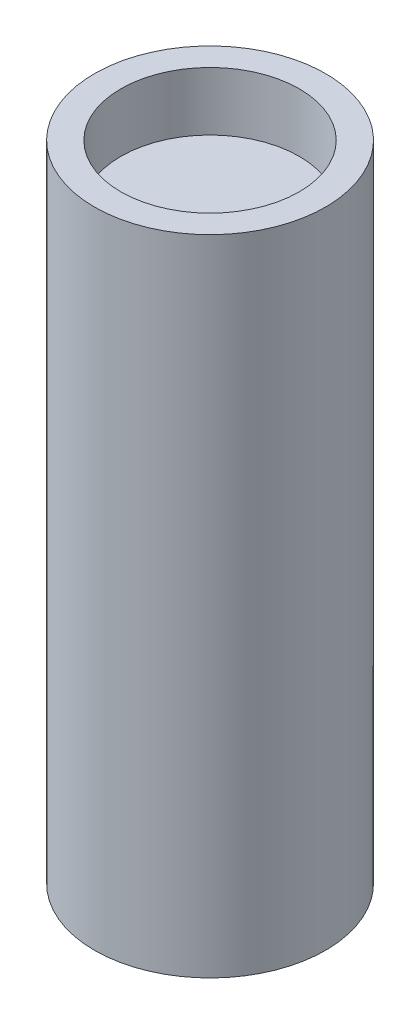
ISO-10303-21;
HEADER;
FILE_DESCRIPTION(('STEP AP214'),'2;1');
FILE_NAME('part.step','',(''),(''),'','','');
FILE_SCHEMA(('AUTOMOTIVE_DESIGN { 1 0 10303 214 1 1 1 1 }'));
ENDSEC;
DATA;
#1=APPLICATION_CONTEXT('core data for automotive mechanical design processes');
#2=APPLICATION_PROTOCOL_DEFINITION('international standard','automotive_design',2000,#1);
#3=PRODUCT_CONTEXT('',#1,'mechanical');
#4=PRODUCT('Part','Part','',(#3));
#5=PRODUCT_RELATED_PRODUCT_CATEGORY('part','',(#4));
#6=PRODUCT_DEFINITION_FORMATION('','',#4);
#7=PRODUCT_DEFINITION_CONTEXT('part definition',#1,'design');
#8=PRODUCT_DEFINITION('design','',#6,#7);
#9=PRODUCT_DEFINITION_SHAPE('','',#8);
#10=(LENGTH_UNIT() NAMED_UNIT(*) SI_UNIT(.MILLI.,.METRE.));
#11=(NAMED_UNIT(*) PLANE_ANGLE_UNIT() SI_UNIT($,.RADIAN.));
#12=(NAMED_UNIT(*) SI_UNIT($,.STERADIAN.) SOLID_ANGLE_UNIT());
#13=UNCERTAINTY_MEASURE_WITH_UNIT(LENGTH_MEASURE(1.E-05),#10,'distance_accuracy_value','');
#14=(GEOMETRIC_REPRESENTATION_CONTEXT(3) GLOBAL_UNCERTAINTY_ASSIGNED_CONTEXT((#13)) GLOBAL_UNIT_ASSIGNED_CONTEXT((#10,
#11,#12)) REPRESENTATION_CONTEXT('',''));
#15=CARTESIAN_POINT('',(0.,0.,0.));
#16=DIRECTION('',(0.,0.,1.));
#17=DIRECTION('',(1.,0.,0.));
#18=AXIS2_PLACEMENT_3D('',#15,#16,#17);
#19=CARTESIAN_POINT('',(0.,20.,0.));
#20=DIRECTION('',(0.,-1.,0.));
#21=DIRECTION('',(0.,0.,-1.));
#22=AXIS2_PLACEMENT_3D('',#19,#20,#21);
#23=CYLINDRICAL_SURFACE('',#22,3.95);
#24=CARTESIAN_POINT('',(0.,0.,0.));
#25=DIRECTION('',(0.,1.,0.));
#26=DIRECTION('',(0.,0.,1.));
#27=AXIS2_PLACEMENT_3D('',#24,#25,#26);
#28=CIRCLE('',#27,3.95);
#29=CARTESIAN_POINT('',(0.,0.,3.95));
#30=VERTEX_POINT('',#29);
#31=EDGE_CURVE('E50',#30,#30,#28,.T.);
#32=ORIENTED_EDGE('',*,*,#31,.T.);
#33=EDGE_LOOP('',(#32));
#34=FACE_BOUND('',#33,.T.);
#35=CARTESIAN_POINT('',(0.,22.,0.));
#36=DIRECTION('',(0.,1.,0.));
#37=DIRECTION('',(0.,0.,1.));
#38=AXIS2_PLACEMENT_3D('',#35,#36,#37);
#39=CIRCLE('',#38,3.95);
#40=CARTESIAN_POINT('',(0.,22.,3.95));
#41=VERTEX_POINT('',#40);
#42=EDGE_CURVE('E55',#41,#41,#39,.T.);
#43=ORIENTED_EDGE('',*,*,#42,.F.);
#44=EDGE_LOOP('',(#43));
#45=FACE_BOUND('',#44,.T.);
#46=ADVANCED_FACE('F43',(#34,#45),#23,.T.);
#47=CARTESIAN_POINT('',(0.,0.,0.));
#48=DIRECTION('',(0.,1.,0.));
#49=DIRECTION('',(0.,0.,1.));
#50=AXIS2_PLACEMENT_3D('',#47,#48,#49);
#51=PLANE('',#50);
#52=ORIENTED_EDGE('',*,*,#31,.F.);
#53=EDGE_LOOP('',(#52));
#54=FACE_BOUND('',#53,.T.);
#55=ADVANCED_FACE('F71',(#54),#51,.F.);
#56=CARTESIAN_POINT('',(0.,22.,0.));
#57=DIRECTION('',(0.,1.,0.));
#58=DIRECTION('',(0.,0.,1.));
#59=AXIS2_PLACEMENT_3D('',#56,#57,#58);
#60=PLANE('',#59);
#61=ORIENTED_EDGE('',*,*,#42,.T.);
#62=EDGE_LOOP('',(#61));
#63=FACE_BOUND('',#62,.T.);
#64=CARTESIAN_POINT('',(0.,22.,0.));
#65=DIRECTION('',(0.,1.,0.));
#66=DIRECTION('',(0.,0.,1.));
#67=AXIS2_PLACEMENT_3D('',#64,#65,#66);
#68=CIRCLE('',#67,3.05);
#69=CARTESIAN_POINT('',(0.,22.,3.05));
#70=VERTEX_POINT('',#69);
#71=EDGE_CURVE('E60',#70,#70,#68,.T.);
#72=ORIENTED_EDGE('',*,*,#71,.F.);
#73=EDGE_LOOP('',(#72));
#74=FACE_BOUND('',#73,.T.);
#75=ADVANCED_FACE('F69',(#63,#74),#60,.T.);
#76=CARTESIAN_POINT('',(0.,22.,0.));
#77=DIRECTION('',(0.,-1.,0.));
#78=DIRECTION('',(0.,0.,-1.));
#79=AXIS2_PLACEMENT_3D('',#76,#77,#78);
#80=CYLINDRICAL_SURFACE('',#79,3.05);
#81=ORIENTED_EDGE('',*,*,#71,.T.);
#82=EDGE_LOOP('',(#81));
#83=FACE_BOUND('',#82,.T.);
#84=CARTESIAN_POINT('',(0.,20.,0.));
#85=DIRECTION('',(0.,1.,0.));
#86=DIRECTION('',(0.,0.,1.));
#87=AXIS2_PLACEMENT_3D('',#84,#85,#86);
#88=CIRCLE('',#87,3.05);
#89=CARTESIAN_POINT('',(0.,20.,3.05));
#90=VERTEX_POINT('',#89);
#91=EDGE_CURVE('E10',#90,#90,#88,.F.);
#92=ORIENTED_EDGE('',*,*,#91,.T.);
#93=EDGE_LOOP('',(#92));
#94=FACE_BOUND('',#93,.T.);
#95=ADVANCED_FACE('F67',(#83,#94),#80,.F.);
#96=CARTESIAN_POINT('',(0.,20.,0.));
#97=DIRECTION('',(0.,1.,0.));
#98=DIRECTION('',(0.,0.,1.));
#99=AXIS2_PLACEMENT_3D('',#96,#97,#98);
#100=PLANE('',#99);
#101=ORIENTED_EDGE('',*,*,#91,.F.);
#102=EDGE_LOOP('',(#101));
#103=FACE_BOUND('',#102,.T.);
#104=ADVANCED_FACE('F78',(#103),#100,.T.);
#105=CLOSED_SHELL('',(#46,#55,#75,#95,#104));
#106=MANIFOLD_SOLID_BREP('B2',#105);
#107=ADVANCED_BREP_SHAPE_REPRESENTATION('',(#18,#106),#14);
#108=SHAPE_DEFINITION_REPRESENTATION(#9,#107);
ENDSEC;
END-ISO-10303-21;
